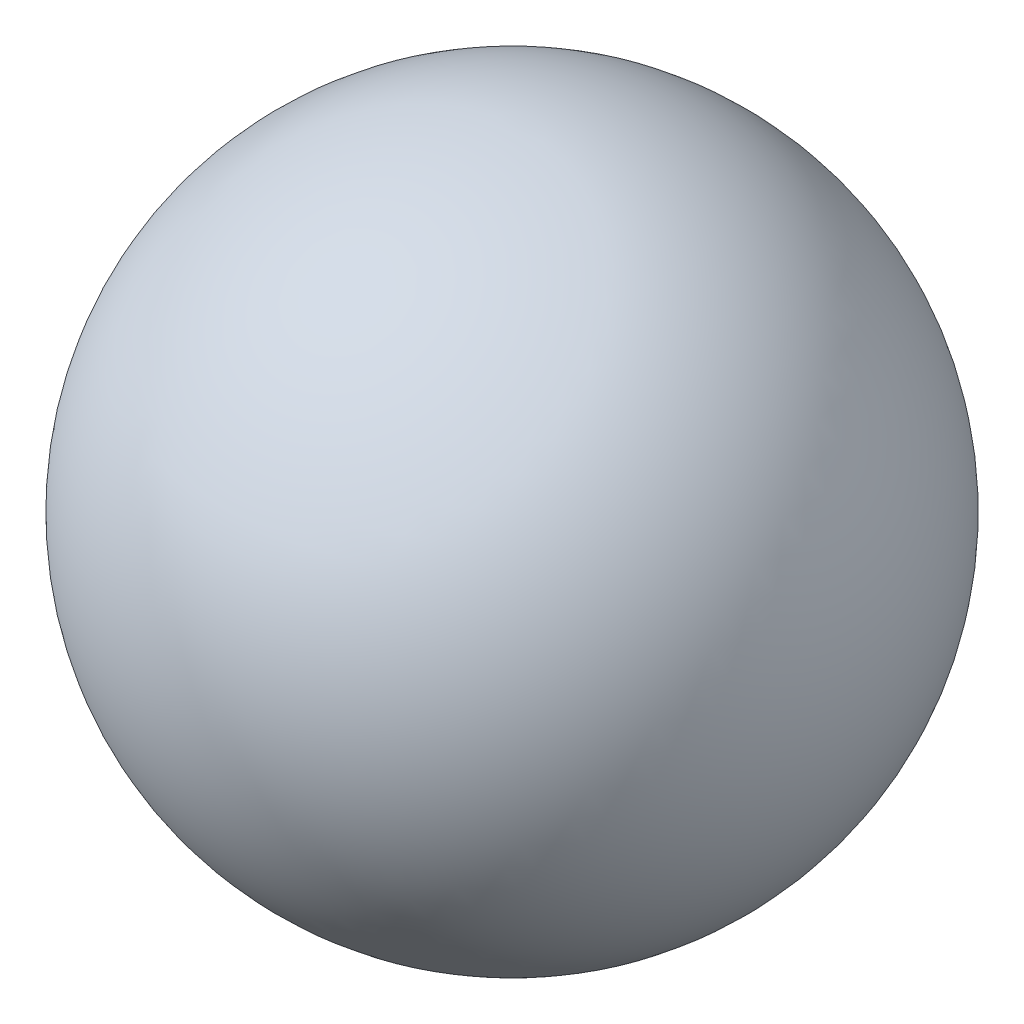
ISO-10303-21;
HEADER;
FILE_DESCRIPTION(('STEP AP214'),'2;1');
FILE_NAME('part.step','',(''),(''),'','','');
FILE_SCHEMA(('AUTOMOTIVE_DESIGN { 1 0 10303 214 1 1 1 1 }'));
ENDSEC;
DATA;
#1=APPLICATION_CONTEXT('core data for automotive mechanical design processes');
#2=APPLICATION_PROTOCOL_DEFINITION('international standard','automotive_design',2000,#1);
#3=PRODUCT_CONTEXT('',#1,'mechanical');
#4=PRODUCT('Part','Part','',(#3));
#5=PRODUCT_RELATED_PRODUCT_CATEGORY('part','',(#4));
#6=PRODUCT_DEFINITION_FORMATION('','',#4);
#7=PRODUCT_DEFINITION_CONTEXT('part definition',#1,'design');
#8=PRODUCT_DEFINITION('design','',#6,#7);
#9=PRODUCT_DEFINITION_SHAPE('','',#8);
#10=(LENGTH_UNIT() NAMED_UNIT(*) SI_UNIT(.MILLI.,.METRE.));
#11=(NAMED_UNIT(*) PLANE_ANGLE_UNIT() SI_UNIT($,.RADIAN.));
#12=(NAMED_UNIT(*) SI_UNIT($,.STERADIAN.) SOLID_ANGLE_UNIT());
#13=UNCERTAINTY_MEASURE_WITH_UNIT(LENGTH_MEASURE(1.E-05),#10,'distance_accuracy_value','');
#14=(GEOMETRIC_REPRESENTATION_CONTEXT(3) GLOBAL_UNCERTAINTY_ASSIGNED_CONTEXT((#13)) GLOBAL_UNIT_ASSIGNED_CONTEXT((#10,
#11,#12)) REPRESENTATION_CONTEXT('',''));
#15=CARTESIAN_POINT('',(0.,0.,0.));
#16=DIRECTION('',(0.,0.,1.));
#17=DIRECTION('',(1.,0.,0.));
#18=AXIS2_PLACEMENT_3D('',#15,#16,#17);
#19=CARTESIAN_POINT('',(0.,0.,0.));
#20=DIRECTION('',(0.,1.,0.));
#21=DIRECTION('',(1.,0.,0.));
#22=AXIS2_PLACEMENT_3D('',#19,#20,#21);
#23=SPHERICAL_SURFACE('',#22,21.);
#24=CARTESIAN_POINT('',(0.,21.,0.));
#25=VERTEX_POINT('',#24);
#26=VERTEX_LOOP('',#25);
#27=FACE_BOUND('',#26,.T.);
#28=ADVANCED_FACE('F33',(#27),#23,.T.);
#29=CLOSED_SHELL('',(#28));
#30=MANIFOLD_SOLID_BREP('B2',#29);
#31=ADVANCED_BREP_SHAPE_REPRESENTATION('',(#18,#30),#14);
#32=SHAPE_DEFINITION_REPRESENTATION(#9,#31);
ENDSEC;
END-ISO-10303-21;
